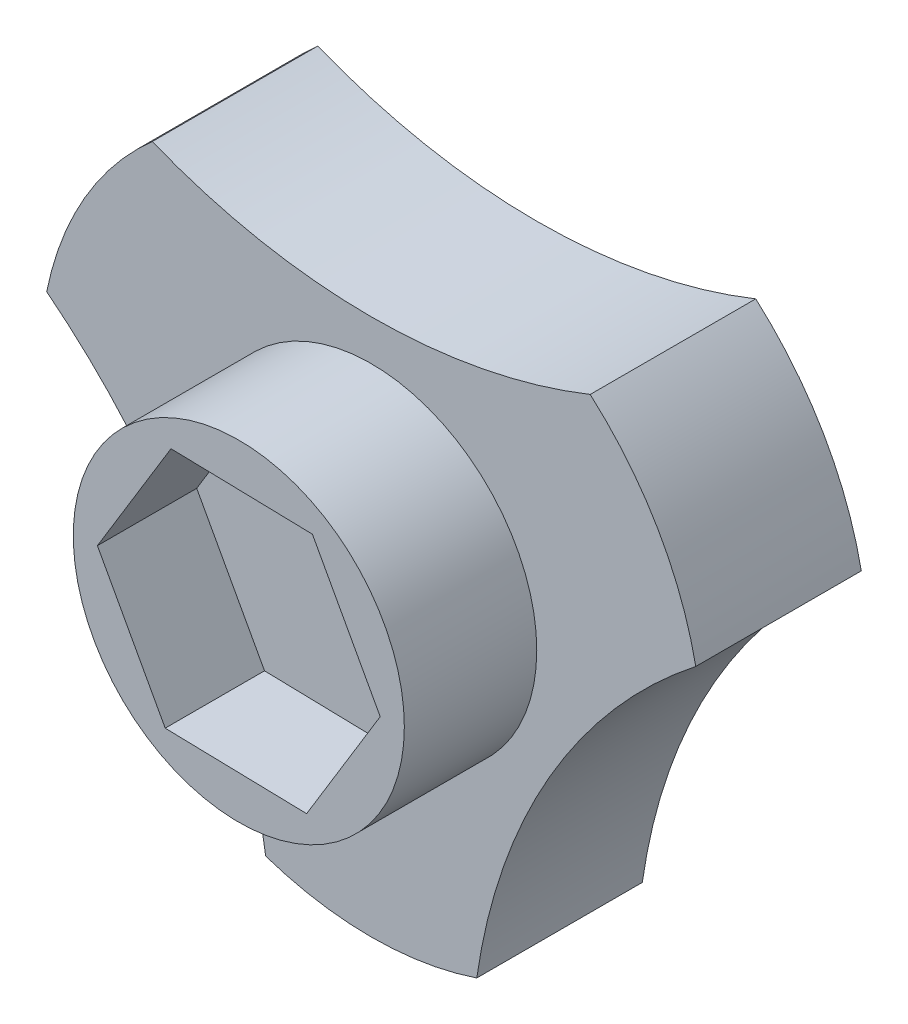
ISO-10303-21;
HEADER;
FILE_DESCRIPTION(('STEP AP214'),'2;1');
FILE_NAME('part.step','',(''),(''),'','','');
FILE_SCHEMA(('AUTOMOTIVE_DESIGN { 1 0 10303 214 1 1 1 1 }'));
ENDSEC;
DATA;
#1=APPLICATION_CONTEXT('core data for automotive mechanical design processes');
#2=APPLICATION_PROTOCOL_DEFINITION('international standard','automotive_design',2000,#1);
#3=PRODUCT_CONTEXT('',#1,'mechanical');
#4=PRODUCT('Part','Part','',(#3));
#5=PRODUCT_RELATED_PRODUCT_CATEGORY('part','',(#4));
#6=PRODUCT_DEFINITION_FORMATION('','',#4);
#7=PRODUCT_DEFINITION_CONTEXT('part definition',#1,'design');
#8=PRODUCT_DEFINITION('design','',#6,#7);
#9=PRODUCT_DEFINITION_SHAPE('','',#8);
#10=(LENGTH_UNIT() NAMED_UNIT(*) SI_UNIT(.MILLI.,.METRE.));
#11=(NAMED_UNIT(*) PLANE_ANGLE_UNIT() SI_UNIT($,.RADIAN.));
#12=(NAMED_UNIT(*) SI_UNIT($,.STERADIAN.) SOLID_ANGLE_UNIT());
#13=UNCERTAINTY_MEASURE_WITH_UNIT(LENGTH_MEASURE(1.E-05),#10,'distance_accuracy_value','');
#14=(GEOMETRIC_REPRESENTATION_CONTEXT(3) GLOBAL_UNCERTAINTY_ASSIGNED_CONTEXT((#13)) GLOBAL_UNIT_ASSIGNED_CONTEXT((#10,
#11,#12)) REPRESENTATION_CONTEXT('',''));
#15=CARTESIAN_POINT('',(0.,0.,0.));
#16=DIRECTION('',(0.,0.,1.));
#17=DIRECTION('',(1.,0.,0.));
#18=AXIS2_PLACEMENT_3D('',#15,#16,#17);
#19=CARTESIAN_POINT('',(0.,0.,5.));
#20=DIRECTION('',(0.,0.,-1.));
#21=DIRECTION('',(-1.,0.,0.));
#22=AXIS2_PLACEMENT_3D('',#19,#20,#21);
#23=CYLINDRICAL_SURFACE('',#22,10.);
#24=DIRECTION('',(0.,0.,1.));
#25=VECTOR('',#24,1.);
#26=CARTESIAN_POINT('',(-6.61437827766147,7.5,0.));
#27=LINE('',#26,#25);
#28=CARTESIAN_POINT('',(-6.61437827766147,7.5,0.));
#29=VERTEX_POINT('',#28);
#30=CARTESIAN_POINT('',(-6.61437827766147,7.5,5.));
#31=VERTEX_POINT('',#30);
#32=EDGE_CURVE('E132',#29,#31,#27,.T.);
#33=ORIENTED_EDGE('',*,*,#32,.F.);
#34=CARTESIAN_POINT('',(0.,0.,0.));
#35=DIRECTION('',(0.,0.,1.));
#36=DIRECTION('',(1.,0.,0.));
#37=AXIS2_PLACEMENT_3D('',#34,#35,#36);
#38=CIRCLE('',#37,10.);
#39=CARTESIAN_POINT('',(-9.80237966721401,1.97821961869489,0.));
#40=VERTEX_POINT('',#39);
#41=EDGE_CURVE('E146',#29,#40,#38,.T.);
#42=ORIENTED_EDGE('',*,*,#41,.T.);
#43=DIRECTION('',(0.,0.,1.));
#44=VECTOR('',#43,1.);
#45=CARTESIAN_POINT('',(-9.80237966721401,1.97821961869489,0.));
#46=LINE('',#45,#44);
#47=CARTESIAN_POINT('',(-9.80237966721401,1.97821961869489,5.));
#48=VERTEX_POINT('',#47);
#49=EDGE_CURVE('E64',#40,#48,#46,.T.);
#50=ORIENTED_EDGE('',*,*,#49,.T.);
#51=CARTESIAN_POINT('',(0.,0.,5.));
#52=DIRECTION('',(0.,0.,1.));
#53=DIRECTION('',(1.,0.,0.));
#54=AXIS2_PLACEMENT_3D('',#51,#52,#53);
#55=CIRCLE('',#54,10.);
#56=EDGE_CURVE('E148',#31,#48,#55,.T.);
#57=ORIENTED_EDGE('',*,*,#56,.F.);
#58=EDGE_LOOP('',(#33,#42,#50,#57));
#59=FACE_BOUND('',#58,.T.);
#60=ADVANCED_FACE('F39',(#59),#23,.T.);
#61=DIRECTION('',(0.,0.,1.));
#62=VECTOR('',#61,1.);
#63=CARTESIAN_POINT('',(6.61437827766147,7.5,0.));
#64=LINE('',#63,#62);
#65=CARTESIAN_POINT('',(6.61437827766146,7.50000000000001,0.));
#66=VERTEX_POINT('',#65);
#67=CARTESIAN_POINT('',(6.61437827766147,7.5,5.));
#68=VERTEX_POINT('',#67);
#69=EDGE_CURVE('E135',#66,#68,#64,.T.);
#70=ORIENTED_EDGE('',*,*,#69,.T.);
#71=CARTESIAN_POINT('',(9.80237966721384,1.978219618695,5.));
#72=VERTEX_POINT('',#71);
#73=EDGE_CURVE('E48',#72,#68,#55,.T.);
#74=ORIENTED_EDGE('',*,*,#73,.F.);
#75=DIRECTION('',(0.,0.,1.));
#76=VECTOR('',#75,1.);
#77=CARTESIAN_POINT('',(9.80237966721384,1.978219618695,0.));
#78=LINE('',#77,#76);
#79=CARTESIAN_POINT('',(9.80237966721384,1.978219618695,0.));
#80=VERTEX_POINT('',#79);
#81=EDGE_CURVE('E193',#80,#72,#78,.T.);
#82=ORIENTED_EDGE('',*,*,#81,.F.);
#83=EDGE_CURVE('E42',#80,#66,#38,.T.);
#84=ORIENTED_EDGE('',*,*,#83,.T.);
#85=EDGE_LOOP('',(#70,#74,#82,#84));
#86=FACE_BOUND('',#85,.T.);
#87=ADVANCED_FACE('F304',(#86),#23,.T.);
#88=DIRECTION('',(0.,0.,1.));
#89=VECTOR('',#88,1.);
#90=CARTESIAN_POINT('',(3.18800138955282,-9.47821961869486,0.));
#91=LINE('',#90,#89);
#92=CARTESIAN_POINT('',(3.1880013895525,-9.47821961869482,0.));
#93=VERTEX_POINT('',#92);
#94=CARTESIAN_POINT('',(3.18800138955282,-9.47821961869486,5.));
#95=VERTEX_POINT('',#94);
#96=EDGE_CURVE('E56',#93,#95,#91,.T.);
#97=ORIENTED_EDGE('',*,*,#96,.T.);
#98=CARTESIAN_POINT('',(-3.18800138955264,-9.47821961869477,5.));
#99=VERTEX_POINT('',#98);
#100=EDGE_CURVE('E159',#99,#95,#55,.T.);
#101=ORIENTED_EDGE('',*,*,#100,.F.);
#102=DIRECTION('',(0.,0.,1.));
#103=VECTOR('',#102,1.);
#104=CARTESIAN_POINT('',(-3.18800138955264,-9.47821961869477,0.));
#105=LINE('',#104,#103);
#106=CARTESIAN_POINT('',(-3.18800138955264,-9.47821961869477,0.));
#107=VERTEX_POINT('',#106);
#108=EDGE_CURVE('E191',#107,#99,#105,.T.);
#109=ORIENTED_EDGE('',*,*,#108,.F.);
#110=EDGE_CURVE('E156',#107,#93,#38,.T.);
#111=ORIENTED_EDGE('',*,*,#110,.T.);
#112=EDGE_LOOP('',(#97,#101,#109,#111));
#113=FACE_BOUND('',#112,.T.);
#114=ADVANCED_FACE('F190',(#113),#23,.T.);
#115=CARTESIAN_POINT('',(0.,0.,5.));
#116=DIRECTION('',(0.,0.,1.));
#117=DIRECTION('',(1.,0.,0.));
#118=AXIS2_PLACEMENT_3D('',#115,#116,#117);
#119=PLANE('',#118);
#120=CARTESIAN_POINT('',(0.,24.,5.));
#121=DIRECTION('',(0.,0.,1.));
#122=DIRECTION('',(1.,0.,0.));
#123=AXIS2_PLACEMENT_3D('',#120,#121,#122);
#124=CIRCLE('',#123,17.7763888346312);
#125=EDGE_CURVE('E141',#31,#68,#124,.T.);
#126=ORIENTED_EDGE('',*,*,#125,.F.);
#127=ORIENTED_EDGE('',*,*,#56,.T.);
#128=CARTESIAN_POINT('',(-20.7846096908266,-11.9999999999998,5.));
#129=DIRECTION('',(0.,0.,1.));
#130=DIRECTION('',(1.,0.,0.));
#131=AXIS2_PLACEMENT_3D('',#128,#129,#130);
#132=CIRCLE('',#131,17.7763888346312);
#133=EDGE_CURVE('E189',#99,#48,#132,.T.);
#134=ORIENTED_EDGE('',*,*,#133,.F.);
#135=ORIENTED_EDGE('',*,*,#100,.T.);
#136=CARTESIAN_POINT('',(20.7846096908268,-11.9999999999993,5.));
#137=DIRECTION('',(0.,0.,1.));
#138=DIRECTION('',(1.,0.,0.));
#139=AXIS2_PLACEMENT_3D('',#136,#137,#138);
#140=CIRCLE('',#139,17.776388834631);
#141=EDGE_CURVE('E188',#72,#95,#140,.T.);
#142=ORIENTED_EDGE('',*,*,#141,.F.);
#143=ORIENTED_EDGE('',*,*,#73,.T.);
#144=EDGE_LOOP('',(#126,#127,#134,#135,#142,#143));
#145=FACE_BOUND('',#144,.T.);
#146=CARTESIAN_POINT('',(0.,0.,5.));
#147=DIRECTION('',(0.,0.,1.));
#148=DIRECTION('',(1.,0.,0.));
#149=AXIS2_PLACEMENT_3D('',#146,#147,#148);
#150=CIRCLE('',#149,5.);
#151=CARTESIAN_POINT('',(5.,0.,5.));
#152=VERTEX_POINT('',#151);
#153=EDGE_CURVE('E11',#152,#152,#150,.T.);
#154=ORIENTED_EDGE('',*,*,#153,.F.);
#155=EDGE_LOOP('',(#154));
#156=FACE_BOUND('',#155,.T.);
#157=ADVANCED_FACE('F186',(#145,#156),#119,.T.);
#158=CARTESIAN_POINT('',(0.,0.,0.));
#159=DIRECTION('',(0.,0.,1.));
#160=DIRECTION('',(1.,0.,0.));
#161=AXIS2_PLACEMENT_3D('',#158,#159,#160);
#162=PLANE('',#161);
#163=ORIENTED_EDGE('',*,*,#41,.F.);
#164=CARTESIAN_POINT('',(0.,24.,0.));
#165=DIRECTION('',(0.,0.,1.));
#166=DIRECTION('',(1.,0.,0.));
#167=AXIS2_PLACEMENT_3D('',#164,#165,#166);
#168=CIRCLE('',#167,17.7763888346312);
#169=EDGE_CURVE('E129',#29,#66,#168,.T.);
#170=ORIENTED_EDGE('',*,*,#169,.T.);
#171=ORIENTED_EDGE('',*,*,#83,.F.);
#172=CARTESIAN_POINT('',(20.7846096908268,-11.9999999999993,0.));
#173=DIRECTION('',(0.,0.,1.));
#174=DIRECTION('',(1.,0.,0.));
#175=AXIS2_PLACEMENT_3D('',#172,#173,#174);
#176=CIRCLE('',#175,17.776388834631);
#177=EDGE_CURVE('E194',#80,#93,#176,.T.);
#178=ORIENTED_EDGE('',*,*,#177,.T.);
#179=ORIENTED_EDGE('',*,*,#110,.F.);
#180=CARTESIAN_POINT('',(-20.7846096908266,-11.9999999999998,0.));
#181=DIRECTION('',(0.,0.,1.));
#182=DIRECTION('',(1.,0.,0.));
#183=AXIS2_PLACEMENT_3D('',#180,#181,#182);
#184=CIRCLE('',#183,17.7763888346312);
#185=EDGE_CURVE('E154',#107,#40,#184,.T.);
#186=ORIENTED_EDGE('',*,*,#185,.T.);
#187=EDGE_LOOP('',(#163,#170,#171,#178,#179,#186));
#188=FACE_BOUND('',#187,.T.);
#189=ADVANCED_FACE('F152',(#188),#162,.F.);
#190=CARTESIAN_POINT('',(0.,0.,9.));
#191=DIRECTION('',(0.,0.,-1.));
#192=DIRECTION('',(-1.,0.,0.));
#193=AXIS2_PLACEMENT_3D('',#190,#191,#192);
#194=CYLINDRICAL_SURFACE('',#193,5.);
#195=CARTESIAN_POINT('',(0.,0.,9.));
#196=DIRECTION('',(0.,0.,1.));
#197=DIRECTION('',(1.,0.,0.));
#198=AXIS2_PLACEMENT_3D('',#195,#196,#197);
#199=CIRCLE('',#198,5.);
#200=CARTESIAN_POINT('',(5.,0.,9.));
#201=VERTEX_POINT('',#200);
#202=EDGE_CURVE('E161',#201,#201,#199,.T.);
#203=ORIENTED_EDGE('',*,*,#202,.F.);
#204=EDGE_LOOP('',(#203));
#205=FACE_BOUND('',#204,.T.);
#206=ORIENTED_EDGE('',*,*,#153,.T.);
#207=EDGE_LOOP('',(#206));
#208=FACE_BOUND('',#207,.T.);
#209=ADVANCED_FACE('F317',(#205,#208),#194,.T.);
#210=CARTESIAN_POINT('',(0.,0.,9.));
#211=DIRECTION('',(0.,0.,1.));
#212=DIRECTION('',(1.,0.,0.));
#213=AXIS2_PLACEMENT_3D('',#210,#211,#212);
#214=PLANE('',#213);
#215=DIRECTION('',(0.999721169778311,-0.023613189049477,0.));
#216=VECTOR('',#215,1.);
#217=CARTESIAN_POINT('',(-2.22296915948154,-3.64852592827943,9.));
#218=LINE('',#217,#216);
#219=CARTESIAN_POINT('',(-2.22296915948154,-3.64852592827943,9.));
#220=VERTEX_POINT('',#219);
#221=CARTESIAN_POINT('',(2.04823156051541,-3.74941072808007,9.));
#222=VERTEX_POINT('',#221);
#223=EDGE_CURVE('E150',#220,#222,#218,.T.);
#224=ORIENTED_EDGE('',*,*,#223,.F.);
#225=DIRECTION('',(0.479410963307944,-0.877590524253851,0.));
#226=VECTOR('',#225,1.);
#227=CARTESIAN_POINT('',(-4.27120071999696,0.100884799800642,9.));
#228=LINE('',#227,#226);
#229=CARTESIAN_POINT('',(-4.27120071999696,0.100884799800642,9.));
#230=VERTEX_POINT('',#229);
#231=EDGE_CURVE('E215',#230,#220,#228,.T.);
#232=ORIENTED_EDGE('',*,*,#231,.F.);
#233=DIRECTION('',(-0.520310206470366,-0.853977335204374,0.));
#234=VECTOR('',#233,1.);
#235=CARTESIAN_POINT('',(-2.04823156051541,3.74941072808007,9.));
#236=LINE('',#235,#234);
#237=CARTESIAN_POINT('',(-2.04823156051541,3.74941072808007,9.));
#238=VERTEX_POINT('',#237);
#239=EDGE_CURVE('E249',#238,#230,#236,.T.);
#240=ORIENTED_EDGE('',*,*,#239,.F.);
#241=DIRECTION('',(-0.999721169778311,0.0236131890494768,0.));
#242=VECTOR('',#241,1.);
#243=CARTESIAN_POINT('',(2.22296915948154,3.64852592827943,9.));
#244=LINE('',#243,#242);
#245=CARTESIAN_POINT('',(2.22296915948154,3.64852592827943,9.));
#246=VERTEX_POINT('',#245);
#247=EDGE_CURVE('E245',#246,#238,#244,.T.);
#248=ORIENTED_EDGE('',*,*,#247,.F.);
#249=DIRECTION('',(-0.479410963307944,0.877590524253851,0.));
#250=VECTOR('',#249,1.);
#251=CARTESIAN_POINT('',(4.27120071999696,-0.100884799800642,9.));
#252=LINE('',#251,#250);
#253=CARTESIAN_POINT('',(4.27120071999696,-0.100884799800642,9.));
#254=VERTEX_POINT('',#253);
#255=EDGE_CURVE('E241',#254,#246,#252,.T.);
#256=ORIENTED_EDGE('',*,*,#255,.F.);
#257=DIRECTION('',(0.520310206470367,0.853977335204374,0.));
#258=VECTOR('',#257,1.);
#259=CARTESIAN_POINT('',(2.04823156051541,-3.74941072808007,9.));
#260=LINE('',#259,#258);
#261=EDGE_CURVE('E237',#222,#254,#260,.T.);
#262=ORIENTED_EDGE('',*,*,#261,.F.);
#263=EDGE_LOOP('',(#224,#232,#240,#248,#256,#262));
#264=FACE_BOUND('',#263,.T.);
#265=ORIENTED_EDGE('',*,*,#202,.T.);
#266=EDGE_LOOP('',(#265));
#267=FACE_BOUND('',#266,.T.);
#268=ADVANCED_FACE('F278',(#264,#267),#214,.T.);
#269=CARTESIAN_POINT('',(-2.22296915948154,-3.64852592827943,6.));
#270=DIRECTION('',(-0.023613189049477,-0.999721169778311,0.));
#271=DIRECTION('',(0.999721169778311,-0.023613189049477,0.));
#272=AXIS2_PLACEMENT_3D('',#269,#270,#271);
#273=PLANE('',#272);
#274=ORIENTED_EDGE('',*,*,#223,.T.);
#275=DIRECTION('',(0.,0.,1.));
#276=VECTOR('',#275,1.);
#277=CARTESIAN_POINT('',(2.04823156051541,-3.74941072808007,6.));
#278=LINE('',#277,#276);
#279=CARTESIAN_POINT('',(2.04823156051541,-3.74941072808007,6.));
#280=VERTEX_POINT('',#279);
#281=EDGE_CURVE('E174',#280,#222,#278,.T.);
#282=ORIENTED_EDGE('',*,*,#281,.F.);
#283=DIRECTION('',(0.999721169778311,-0.023613189049477,0.));
#284=VECTOR('',#283,1.);
#285=CARTESIAN_POINT('',(-2.22296915948154,-3.64852592827943,6.));
#286=LINE('',#285,#284);
#287=CARTESIAN_POINT('',(-2.22296915948154,-3.64852592827943,6.));
#288=VERTEX_POINT('',#287);
#289=EDGE_CURVE('E210',#288,#280,#286,.T.);
#290=ORIENTED_EDGE('',*,*,#289,.F.);
#291=DIRECTION('',(0.,0.,1.));
#292=VECTOR('',#291,1.);
#293=CARTESIAN_POINT('',(-2.22296915948154,-3.64852592827943,6.));
#294=LINE('',#293,#292);
#295=EDGE_CURVE('E166',#288,#220,#294,.T.);
#296=ORIENTED_EDGE('',*,*,#295,.T.);
#297=EDGE_LOOP('',(#274,#282,#290,#296));
#298=FACE_BOUND('',#297,.T.);
#299=ADVANCED_FACE('F290',(#298),#273,.F.);
#300=CARTESIAN_POINT('',(-4.27120071999696,0.100884799800642,6.));
#301=DIRECTION('',(-0.877590524253851,-0.479410963307944,0.));
#302=DIRECTION('',(0.479410963307944,-0.877590524253851,0.));
#303=AXIS2_PLACEMENT_3D('',#300,#301,#302);
#304=PLANE('',#303);
#305=ORIENTED_EDGE('',*,*,#231,.T.);
#306=ORIENTED_EDGE('',*,*,#295,.F.);
#307=DIRECTION('',(0.479410963307944,-0.877590524253851,0.));
#308=VECTOR('',#307,1.);
#309=CARTESIAN_POINT('',(-4.27120071999696,0.100884799800642,6.));
#310=LINE('',#309,#308);
#311=CARTESIAN_POINT('',(-4.27120071999696,0.100884799800642,6.));
#312=VERTEX_POINT('',#311);
#313=EDGE_CURVE('E231',#312,#288,#310,.T.);
#314=ORIENTED_EDGE('',*,*,#313,.F.);
#315=DIRECTION('',(0.,0.,1.));
#316=VECTOR('',#315,1.);
#317=CARTESIAN_POINT('',(-4.27120071999696,0.100884799800642,6.));
#318=LINE('',#317,#316);
#319=EDGE_CURVE('E171',#312,#230,#318,.T.);
#320=ORIENTED_EDGE('',*,*,#319,.T.);
#321=EDGE_LOOP('',(#305,#306,#314,#320));
#322=FACE_BOUND('',#321,.T.);
#323=ADVANCED_FACE('F292',(#322),#304,.F.);
#324=CARTESIAN_POINT('',(-2.04823156051541,3.74941072808007,6.));
#325=DIRECTION('',(-0.853977335204375,0.520310206470367,0.));
#326=DIRECTION('',(-0.520310206470367,-0.853977335204375,0.));
#327=AXIS2_PLACEMENT_3D('',#324,#325,#326);
#328=PLANE('',#327);
#329=ORIENTED_EDGE('',*,*,#239,.T.);
#330=ORIENTED_EDGE('',*,*,#319,.F.);
#331=DIRECTION('',(-0.520310206470366,-0.853977335204374,0.));
#332=VECTOR('',#331,1.);
#333=CARTESIAN_POINT('',(-2.04823156051541,3.74941072808007,6.));
#334=LINE('',#333,#332);
#335=CARTESIAN_POINT('',(-2.04823156051541,3.74941072808007,6.));
#336=VERTEX_POINT('',#335);
#337=EDGE_CURVE('E227',#336,#312,#334,.T.);
#338=ORIENTED_EDGE('',*,*,#337,.F.);
#339=DIRECTION('',(0.,0.,1.));
#340=VECTOR('',#339,1.);
#341=CARTESIAN_POINT('',(-2.04823156051541,3.74941072808007,6.));
#342=LINE('',#341,#340);
#343=EDGE_CURVE('E258',#336,#238,#342,.T.);
#344=ORIENTED_EDGE('',*,*,#343,.T.);
#345=EDGE_LOOP('',(#329,#330,#338,#344));
#346=FACE_BOUND('',#345,.T.);
#347=ADVANCED_FACE('F294',(#346),#328,.F.);
#348=CARTESIAN_POINT('',(2.22296915948154,3.64852592827943,6.));
#349=DIRECTION('',(0.0236131890494768,0.99972116977831,0.));
#350=DIRECTION('',(-0.999721169778311,0.0236131890494768,0.));
#351=AXIS2_PLACEMENT_3D('',#348,#349,#350);
#352=PLANE('',#351);
#353=ORIENTED_EDGE('',*,*,#247,.T.);
#354=ORIENTED_EDGE('',*,*,#343,.F.);
#355=DIRECTION('',(-0.999721169778311,0.0236131890494768,0.));
#356=VECTOR('',#355,1.);
#357=CARTESIAN_POINT('',(2.22296915948154,3.64852592827943,6.));
#358=LINE('',#357,#356);
#359=CARTESIAN_POINT('',(2.22296915948154,3.64852592827943,6.));
#360=VERTEX_POINT('',#359);
#361=EDGE_CURVE('E223',#360,#336,#358,.T.);
#362=ORIENTED_EDGE('',*,*,#361,.F.);
#363=DIRECTION('',(0.,0.,1.));
#364=VECTOR('',#363,1.);
#365=CARTESIAN_POINT('',(2.22296915948154,3.64852592827943,6.));
#366=LINE('',#365,#364);
#367=EDGE_CURVE('E261',#360,#246,#366,.T.);
#368=ORIENTED_EDGE('',*,*,#367,.T.);
#369=EDGE_LOOP('',(#353,#354,#362,#368));
#370=FACE_BOUND('',#369,.T.);
#371=ADVANCED_FACE('F285',(#370),#352,.F.);
#372=CARTESIAN_POINT('',(4.27120071999696,-0.100884799800642,6.));
#373=DIRECTION('',(0.877590524253851,0.479410963307944,0.));
#374=DIRECTION('',(-0.479410963307944,0.877590524253851,0.));
#375=AXIS2_PLACEMENT_3D('',#372,#373,#374);
#376=PLANE('',#375);
#377=ORIENTED_EDGE('',*,*,#255,.T.);
#378=ORIENTED_EDGE('',*,*,#367,.F.);
#379=DIRECTION('',(-0.479410963307944,0.877590524253851,0.));
#380=VECTOR('',#379,1.);
#381=CARTESIAN_POINT('',(4.27120071999696,-0.100884799800642,6.));
#382=LINE('',#381,#380);
#383=CARTESIAN_POINT('',(4.27120071999696,-0.100884799800642,6.));
#384=VERTEX_POINT('',#383);
#385=EDGE_CURVE('E219',#384,#360,#382,.T.);
#386=ORIENTED_EDGE('',*,*,#385,.F.);
#387=DIRECTION('',(0.,0.,1.));
#388=VECTOR('',#387,1.);
#389=CARTESIAN_POINT('',(4.27120071999696,-0.100884799800642,6.));
#390=LINE('',#389,#388);
#391=EDGE_CURVE('E263',#384,#254,#390,.T.);
#392=ORIENTED_EDGE('',*,*,#391,.T.);
#393=EDGE_LOOP('',(#377,#378,#386,#392));
#394=FACE_BOUND('',#393,.T.);
#395=ADVANCED_FACE('F282',(#394),#376,.F.);
#396=CARTESIAN_POINT('',(2.04823156051541,-3.74941072808007,6.));
#397=DIRECTION('',(0.853977335204374,-0.520310206470367,0.));
#398=DIRECTION('',(0.520310206470367,0.853977335204374,0.));
#399=AXIS2_PLACEMENT_3D('',#396,#397,#398);
#400=PLANE('',#399);
#401=ORIENTED_EDGE('',*,*,#261,.T.);
#402=ORIENTED_EDGE('',*,*,#391,.F.);
#403=DIRECTION('',(0.520310206470367,0.853977335204374,0.));
#404=VECTOR('',#403,1.);
#405=CARTESIAN_POINT('',(2.04823156051541,-3.74941072808007,6.));
#406=LINE('',#405,#404);
#407=EDGE_CURVE('E214',#280,#384,#406,.T.);
#408=ORIENTED_EDGE('',*,*,#407,.F.);
#409=ORIENTED_EDGE('',*,*,#281,.T.);
#410=EDGE_LOOP('',(#401,#402,#408,#409));
#411=FACE_BOUND('',#410,.T.);
#412=ADVANCED_FACE('F272',(#411),#400,.F.);
#413=CARTESIAN_POINT('',(0.,0.,6.));
#414=DIRECTION('',(0.,0.,1.));
#415=DIRECTION('',(1.,0.,0.));
#416=AXIS2_PLACEMENT_3D('',#413,#414,#415);
#417=PLANE('',#416);
#418=ORIENTED_EDGE('',*,*,#289,.T.);
#419=ORIENTED_EDGE('',*,*,#407,.T.);
#420=ORIENTED_EDGE('',*,*,#385,.T.);
#421=ORIENTED_EDGE('',*,*,#361,.T.);
#422=ORIENTED_EDGE('',*,*,#337,.T.);
#423=ORIENTED_EDGE('',*,*,#313,.T.);
#424=EDGE_LOOP('',(#418,#419,#420,#421,#422,#423));
#425=FACE_BOUND('',#424,.T.);
#426=ADVANCED_FACE('F288',(#425),#417,.T.);
#427=CARTESIAN_POINT('',(-20.7846096908266,-11.9999999999998,0.));
#428=DIRECTION('',(0.,0.,1.));
#429=DIRECTION('',(1.,0.,0.));
#430=AXIS2_PLACEMENT_3D('',#427,#428,#429);
#431=CYLINDRICAL_SURFACE('',#430,17.7763888346312);
#432=ORIENTED_EDGE('',*,*,#133,.T.);
#433=ORIENTED_EDGE('',*,*,#49,.F.);
#434=ORIENTED_EDGE('',*,*,#185,.F.);
#435=ORIENTED_EDGE('',*,*,#108,.T.);
#436=EDGE_LOOP('',(#432,#433,#434,#435));
#437=FACE_BOUND('',#436,.T.);
#438=ADVANCED_FACE('F343',(#437),#431,.F.);
#439=CARTESIAN_POINT('',(20.7846096908268,-11.9999999999993,0.));
#440=DIRECTION('',(0.,0.,1.));
#441=DIRECTION('',(1.,0.,0.));
#442=AXIS2_PLACEMENT_3D('',#439,#440,#441);
#443=CYLINDRICAL_SURFACE('',#442,17.776388834631);
#444=ORIENTED_EDGE('',*,*,#141,.T.);
#445=ORIENTED_EDGE('',*,*,#96,.F.);
#446=ORIENTED_EDGE('',*,*,#177,.F.);
#447=ORIENTED_EDGE('',*,*,#81,.T.);
#448=EDGE_LOOP('',(#444,#445,#446,#447));
#449=FACE_BOUND('',#448,.T.);
#450=ADVANCED_FACE('F350',(#449),#443,.F.);
#451=CARTESIAN_POINT('',(0.,24.,0.));
#452=DIRECTION('',(0.,0.,1.));
#453=DIRECTION('',(1.,0.,0.));
#454=AXIS2_PLACEMENT_3D('',#451,#452,#453);
#455=CYLINDRICAL_SURFACE('',#454,17.7763888346312);
#456=ORIENTED_EDGE('',*,*,#125,.T.);
#457=ORIENTED_EDGE('',*,*,#69,.F.);
#458=ORIENTED_EDGE('',*,*,#169,.F.);
#459=ORIENTED_EDGE('',*,*,#32,.T.);
#460=EDGE_LOOP('',(#456,#457,#458,#459));
#461=FACE_BOUND('',#460,.T.);
#462=ADVANCED_FACE('F131',(#461),#455,.F.);
#463=CLOSED_SHELL('',(#60,#87,#114,#157,#189,#209,#268,#299,#323,#347,#371,#395,#412,#426,#438,
#450,#462));
#464=MANIFOLD_SOLID_BREP('B2',#463);
#465=ADVANCED_BREP_SHAPE_REPRESENTATION('',(#18,#464),#14);
#466=SHAPE_DEFINITION_REPRESENTATION(#9,#465);
ENDSEC;
END-ISO-10303-21;
